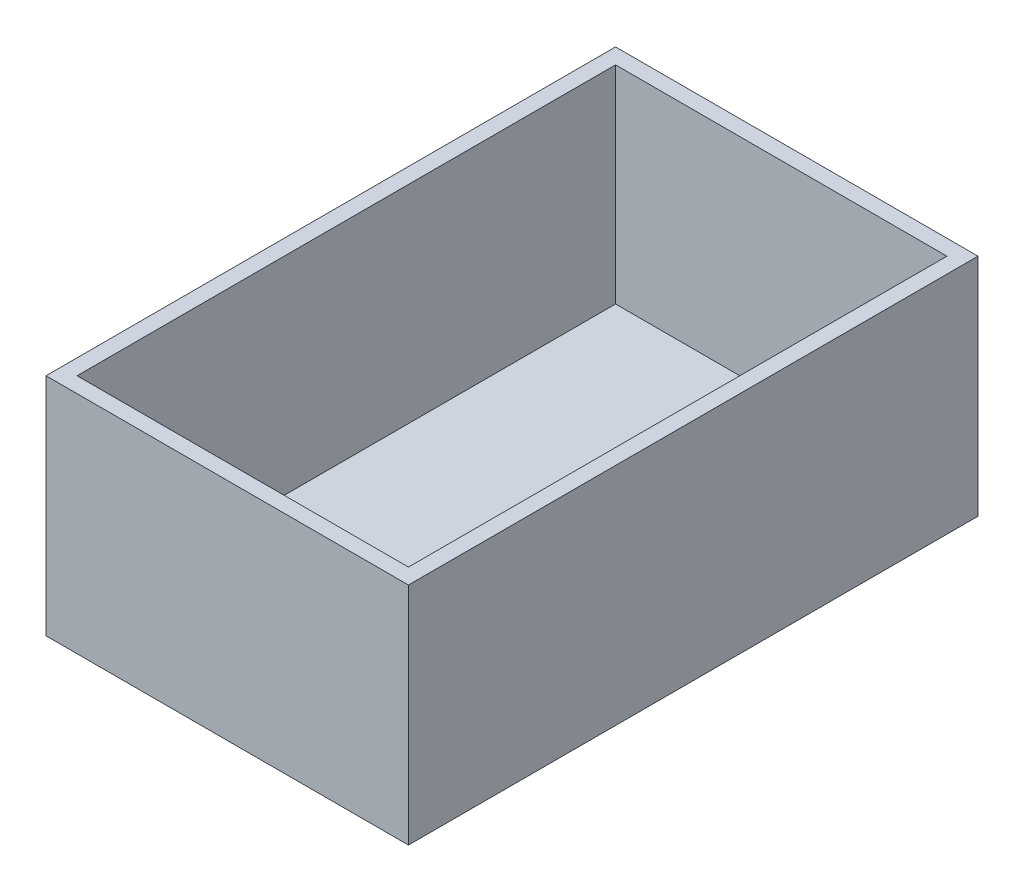
ISO-10303-21;
HEADER;
FILE_DESCRIPTION(('STEP AP214'),'2;1');
FILE_NAME('part.step','',(''),(''),'','','');
FILE_SCHEMA(('AUTOMOTIVE_DESIGN { 1 0 10303 214 1 1 1 1 }'));
ENDSEC;
DATA;
#1=APPLICATION_CONTEXT('core data for automotive mechanical design processes');
#2=APPLICATION_PROTOCOL_DEFINITION('international standard','automotive_design',2000,#1);
#3=PRODUCT_CONTEXT('',#1,'mechanical');
#4=PRODUCT('Part','Part','',(#3));
#5=PRODUCT_RELATED_PRODUCT_CATEGORY('part','',(#4));
#6=PRODUCT_DEFINITION_FORMATION('','',#4);
#7=PRODUCT_DEFINITION_CONTEXT('part definition',#1,'design');
#8=PRODUCT_DEFINITION('design','',#6,#7);
#9=PRODUCT_DEFINITION_SHAPE('','',#8);
#10=(LENGTH_UNIT() NAMED_UNIT(*) SI_UNIT(.MILLI.,.METRE.));
#11=(NAMED_UNIT(*) PLANE_ANGLE_UNIT() SI_UNIT($,.RADIAN.));
#12=(NAMED_UNIT(*) SI_UNIT($,.STERADIAN.) SOLID_ANGLE_UNIT());
#13=UNCERTAINTY_MEASURE_WITH_UNIT(LENGTH_MEASURE(1.E-05),#10,'distance_accuracy_value','');
#14=(GEOMETRIC_REPRESENTATION_CONTEXT(3) GLOBAL_UNCERTAINTY_ASSIGNED_CONTEXT((#13)) GLOBAL_UNIT_ASSIGNED_CONTEXT((#10,
#11,#12)) REPRESENTATION_CONTEXT('',''));
#15=CARTESIAN_POINT('',(0.,0.,0.));
#16=DIRECTION('',(0.,0.,1.));
#17=DIRECTION('',(1.,0.,0.));
#18=AXIS2_PLACEMENT_3D('',#15,#16,#17);
#19=CARTESIAN_POINT('',(-35.,3.5,55.));
#20=DIRECTION('',(1.,0.,0.));
#21=DIRECTION('',(0.,0.,-1.));
#22=AXIS2_PLACEMENT_3D('',#19,#20,#21);
#23=PLANE('',#22);
#24=DIRECTION('',(0.,0.,1.));
#25=VECTOR('',#24,1.);
#26=CARTESIAN_POINT('',(-35.,0.,55.));
#27=LINE('',#26,#25);
#28=CARTESIAN_POINT('',(-35.,0.,-55.));
#29=VERTEX_POINT('',#28);
#30=CARTESIAN_POINT('',(-35.,0.,55.));
#31=VERTEX_POINT('',#30);
#32=EDGE_CURVE('E144',#29,#31,#27,.T.);
#33=ORIENTED_EDGE('',*,*,#32,.T.);
#34=DIRECTION('',(0.,-1.,0.));
#35=VECTOR('',#34,1.);
#36=CARTESIAN_POINT('',(-35.,3.5,55.));
#37=LINE('',#36,#35);
#38=CARTESIAN_POINT('',(-35.,43.5,55.));
#39=VERTEX_POINT('',#38);
#40=EDGE_CURVE('E11',#39,#31,#37,.T.);
#41=ORIENTED_EDGE('',*,*,#40,.F.);
#42=DIRECTION('',(0.,0.,1.));
#43=VECTOR('',#42,1.);
#44=CARTESIAN_POINT('',(-35.,43.5,55.));
#45=LINE('',#44,#43);
#46=CARTESIAN_POINT('',(-35.,43.5,-55.));
#47=VERTEX_POINT('',#46);
#48=EDGE_CURVE('E111',#47,#39,#45,.T.);
#49=ORIENTED_EDGE('',*,*,#48,.F.);
#50=DIRECTION('',(0.,-1.,0.));
#51=VECTOR('',#50,1.);
#52=CARTESIAN_POINT('',(-35.,3.5,-55.));
#53=LINE('',#52,#51);
#54=EDGE_CURVE('E153',#47,#29,#53,.T.);
#55=ORIENTED_EDGE('',*,*,#54,.T.);
#56=EDGE_LOOP('',(#33,#41,#49,#55));
#57=FACE_BOUND('',#56,.T.);
#58=ADVANCED_FACE('F33',(#57),#23,.F.);
#59=CARTESIAN_POINT('',(35.,3.5,55.));
#60=DIRECTION('',(0.,0.,-1.));
#61=DIRECTION('',(-1.,0.,0.));
#62=AXIS2_PLACEMENT_3D('',#59,#60,#61);
#63=PLANE('',#62);
#64=DIRECTION('',(1.,0.,0.));
#65=VECTOR('',#64,1.);
#66=CARTESIAN_POINT('',(35.,0.,55.));
#67=LINE('',#66,#65);
#68=CARTESIAN_POINT('',(35.,0.,55.));
#69=VERTEX_POINT('',#68);
#70=EDGE_CURVE('E147',#31,#69,#67,.T.);
#71=ORIENTED_EDGE('',*,*,#70,.T.);
#72=DIRECTION('',(0.,-1.,0.));
#73=VECTOR('',#72,1.);
#74=CARTESIAN_POINT('',(35.,3.5,55.));
#75=LINE('',#74,#73);
#76=CARTESIAN_POINT('',(35.,43.5,55.));
#77=VERTEX_POINT('',#76);
#78=EDGE_CURVE('E40',#77,#69,#75,.T.);
#79=ORIENTED_EDGE('',*,*,#78,.F.);
#80=DIRECTION('',(1.,0.,0.));
#81=VECTOR('',#80,1.);
#82=CARTESIAN_POINT('',(35.,43.5,55.));
#83=LINE('',#82,#81);
#84=EDGE_CURVE('E135',#39,#77,#83,.T.);
#85=ORIENTED_EDGE('',*,*,#84,.F.);
#86=ORIENTED_EDGE('',*,*,#40,.T.);
#87=EDGE_LOOP('',(#71,#79,#85,#86));
#88=FACE_BOUND('',#87,.T.);
#89=ADVANCED_FACE('F175',(#88),#63,.F.);
#90=CARTESIAN_POINT('',(35.,3.5,55.));
#91=DIRECTION('',(-1.,0.,0.));
#92=DIRECTION('',(0.,0.,1.));
#93=AXIS2_PLACEMENT_3D('',#90,#91,#92);
#94=PLANE('',#93);
#95=DIRECTION('',(0.,0.,-1.));
#96=VECTOR('',#95,1.);
#97=CARTESIAN_POINT('',(35.,0.,55.));
#98=LINE('',#97,#96);
#99=CARTESIAN_POINT('',(35.,0.,-55.));
#100=VERTEX_POINT('',#99);
#101=EDGE_CURVE('E149',#69,#100,#98,.T.);
#102=ORIENTED_EDGE('',*,*,#101,.T.);
#103=DIRECTION('',(0.,-1.,0.));
#104=VECTOR('',#103,1.);
#105=CARTESIAN_POINT('',(35.,3.5,-55.));
#106=LINE('',#105,#104);
#107=CARTESIAN_POINT('',(35.,43.5,-55.));
#108=VERTEX_POINT('',#107);
#109=EDGE_CURVE('E156',#108,#100,#106,.T.);
#110=ORIENTED_EDGE('',*,*,#109,.F.);
#111=DIRECTION('',(0.,0.,-1.));
#112=VECTOR('',#111,1.);
#113=CARTESIAN_POINT('',(35.,43.5,-55.));
#114=LINE('',#113,#112);
#115=EDGE_CURVE('E138',#77,#108,#114,.T.);
#116=ORIENTED_EDGE('',*,*,#115,.F.);
#117=ORIENTED_EDGE('',*,*,#78,.T.);
#118=EDGE_LOOP('',(#102,#110,#116,#117));
#119=FACE_BOUND('',#118,.T.);
#120=ADVANCED_FACE('F162',(#119),#94,.F.);
#121=CARTESIAN_POINT('',(35.,3.5,-55.));
#122=DIRECTION('',(0.,0.,1.));
#123=DIRECTION('',(1.,0.,0.));
#124=AXIS2_PLACEMENT_3D('',#121,#122,#123);
#125=PLANE('',#124);
#126=DIRECTION('',(-1.,0.,0.));
#127=VECTOR('',#126,1.);
#128=CARTESIAN_POINT('',(35.,0.,-55.));
#129=LINE('',#128,#127);
#130=EDGE_CURVE('E151',#100,#29,#129,.T.);
#131=ORIENTED_EDGE('',*,*,#130,.T.);
#132=ORIENTED_EDGE('',*,*,#54,.F.);
#133=DIRECTION('',(-1.,0.,0.));
#134=VECTOR('',#133,1.);
#135=CARTESIAN_POINT('',(-35.,43.5,-55.));
#136=LINE('',#135,#134);
#137=EDGE_CURVE('E141',#108,#47,#136,.T.);
#138=ORIENTED_EDGE('',*,*,#137,.F.);
#139=ORIENTED_EDGE('',*,*,#109,.T.);
#140=EDGE_LOOP('',(#131,#132,#138,#139));
#141=FACE_BOUND('',#140,.T.);
#142=ADVANCED_FACE('F170',(#141),#125,.F.);
#143=CARTESIAN_POINT('',(0.,0.,0.));
#144=DIRECTION('',(0.,1.,0.));
#145=DIRECTION('',(0.,0.,1.));
#146=AXIS2_PLACEMENT_3D('',#143,#144,#145);
#147=PLANE('',#146);
#148=ORIENTED_EDGE('',*,*,#32,.F.);
#149=ORIENTED_EDGE('',*,*,#130,.F.);
#150=ORIENTED_EDGE('',*,*,#101,.F.);
#151=ORIENTED_EDGE('',*,*,#70,.F.);
#152=EDGE_LOOP('',(#148,#149,#150,#151));
#153=FACE_BOUND('',#152,.T.);
#154=ADVANCED_FACE('F168',(#153),#147,.F.);
#155=CARTESIAN_POINT('',(0.,43.5,0.));
#156=DIRECTION('',(0.,-1.,0.));
#157=DIRECTION('',(0.,0.,-1.));
#158=AXIS2_PLACEMENT_3D('',#155,#156,#157);
#159=PLANE('',#158);
#160=ORIENTED_EDGE('',*,*,#48,.T.);
#161=ORIENTED_EDGE('',*,*,#84,.T.);
#162=ORIENTED_EDGE('',*,*,#115,.T.);
#163=ORIENTED_EDGE('',*,*,#137,.T.);
#164=EDGE_LOOP('',(#160,#161,#162,#163));
#165=FACE_BOUND('',#164,.T.);
#166=DIRECTION('',(0.,0.,1.));
#167=VECTOR('',#166,1.);
#168=CARTESIAN_POINT('',(-32.,43.5,52.));
#169=LINE('',#168,#167);
#170=CARTESIAN_POINT('',(-32.,43.5,-52.));
#171=VERTEX_POINT('',#170);
#172=CARTESIAN_POINT('',(-32.,43.5,52.));
#173=VERTEX_POINT('',#172);
#174=EDGE_CURVE('E96',#171,#173,#169,.T.);
#175=ORIENTED_EDGE('',*,*,#174,.F.);
#176=DIRECTION('',(-1.,0.,0.));
#177=VECTOR('',#176,1.);
#178=CARTESIAN_POINT('',(-32.,43.5,-52.));
#179=LINE('',#178,#177);
#180=CARTESIAN_POINT('',(32.,43.5,-52.));
#181=VERTEX_POINT('',#180);
#182=EDGE_CURVE('E119',#181,#171,#179,.T.);
#183=ORIENTED_EDGE('',*,*,#182,.F.);
#184=DIRECTION('',(0.,0.,-1.));
#185=VECTOR('',#184,1.);
#186=CARTESIAN_POINT('',(32.,43.5,-52.));
#187=LINE('',#186,#185);
#188=CARTESIAN_POINT('',(32.,43.5,52.));
#189=VERTEX_POINT('',#188);
#190=EDGE_CURVE('E117',#189,#181,#187,.T.);
#191=ORIENTED_EDGE('',*,*,#190,.F.);
#192=DIRECTION('',(1.,0.,0.));
#193=VECTOR('',#192,1.);
#194=CARTESIAN_POINT('',(32.,43.5,52.));
#195=LINE('',#194,#193);
#196=EDGE_CURVE('E105',#173,#189,#195,.T.);
#197=ORIENTED_EDGE('',*,*,#196,.F.);
#198=EDGE_LOOP('',(#175,#183,#191,#197));
#199=FACE_BOUND('',#198,.T.);
#200=ADVANCED_FACE('F115',(#165,#199),#159,.F.);
#201=CARTESIAN_POINT('',(-32.,43.5,52.));
#202=DIRECTION('',(1.,0.,0.));
#203=DIRECTION('',(0.,0.,-1.));
#204=AXIS2_PLACEMENT_3D('',#201,#202,#203);
#205=PLANE('',#204);
#206=DIRECTION('',(0.,0.,1.));
#207=VECTOR('',#206,1.);
#208=CARTESIAN_POINT('',(-32.,3.5,52.));
#209=LINE('',#208,#207);
#210=CARTESIAN_POINT('',(-32.,3.5,-52.));
#211=VERTEX_POINT('',#210);
#212=CARTESIAN_POINT('',(-32.,3.5,52.));
#213=VERTEX_POINT('',#212);
#214=EDGE_CURVE('E47',#211,#213,#209,.T.);
#215=ORIENTED_EDGE('',*,*,#214,.F.);
#216=DIRECTION('',(0.,-1.,0.));
#217=VECTOR('',#216,1.);
#218=CARTESIAN_POINT('',(-32.,43.5,-52.));
#219=LINE('',#218,#217);
#220=EDGE_CURVE('E101',#171,#211,#219,.T.);
#221=ORIENTED_EDGE('',*,*,#220,.F.);
#222=ORIENTED_EDGE('',*,*,#174,.T.);
#223=DIRECTION('',(0.,-1.,0.));
#224=VECTOR('',#223,1.);
#225=CARTESIAN_POINT('',(-32.,43.5,52.));
#226=LINE('',#225,#224);
#227=EDGE_CURVE('E99',#173,#213,#226,.T.);
#228=ORIENTED_EDGE('',*,*,#227,.T.);
#229=EDGE_LOOP('',(#215,#221,#222,#228));
#230=FACE_BOUND('',#229,.T.);
#231=ADVANCED_FACE('F98',(#230),#205,.T.);
#232=CARTESIAN_POINT('',(32.,43.5,52.));
#233=DIRECTION('',(0.,0.,-1.));
#234=DIRECTION('',(-1.,0.,0.));
#235=AXIS2_PLACEMENT_3D('',#232,#233,#234);
#236=PLANE('',#235);
#237=DIRECTION('',(1.,0.,0.));
#238=VECTOR('',#237,1.);
#239=CARTESIAN_POINT('',(32.,3.5,52.));
#240=LINE('',#239,#238);
#241=CARTESIAN_POINT('',(32.,3.5,52.));
#242=VERTEX_POINT('',#241);
#243=EDGE_CURVE('E51',#213,#242,#240,.T.);
#244=ORIENTED_EDGE('',*,*,#243,.F.);
#245=ORIENTED_EDGE('',*,*,#227,.F.);
#246=ORIENTED_EDGE('',*,*,#196,.T.);
#247=DIRECTION('',(0.,-1.,0.));
#248=VECTOR('',#247,1.);
#249=CARTESIAN_POINT('',(32.,43.5,52.));
#250=LINE('',#249,#248);
#251=EDGE_CURVE('E112',#189,#242,#250,.T.);
#252=ORIENTED_EDGE('',*,*,#251,.T.);
#253=EDGE_LOOP('',(#244,#245,#246,#252));
#254=FACE_BOUND('',#253,.T.);
#255=ADVANCED_FACE('F109',(#254),#236,.T.);
#256=CARTESIAN_POINT('',(32.,43.5,-52.));
#257=DIRECTION('',(-1.,0.,0.));
#258=DIRECTION('',(0.,0.,1.));
#259=AXIS2_PLACEMENT_3D('',#256,#257,#258);
#260=PLANE('',#259);
#261=DIRECTION('',(0.,0.,-1.));
#262=VECTOR('',#261,1.);
#263=CARTESIAN_POINT('',(32.,3.5,-52.));
#264=LINE('',#263,#262);
#265=CARTESIAN_POINT('',(32.,3.5,-52.));
#266=VERTEX_POINT('',#265);
#267=EDGE_CURVE('E125',#242,#266,#264,.T.);
#268=ORIENTED_EDGE('',*,*,#267,.F.);
#269=ORIENTED_EDGE('',*,*,#251,.F.);
#270=ORIENTED_EDGE('',*,*,#190,.T.);
#271=DIRECTION('',(0.,-1.,0.));
#272=VECTOR('',#271,1.);
#273=CARTESIAN_POINT('',(32.,43.5,-52.));
#274=LINE('',#273,#272);
#275=EDGE_CURVE('E129',#181,#266,#274,.T.);
#276=ORIENTED_EDGE('',*,*,#275,.T.);
#277=EDGE_LOOP('',(#268,#269,#270,#276));
#278=FACE_BOUND('',#277,.T.);
#279=ADVANCED_FACE('F197',(#278),#260,.T.);
#280=CARTESIAN_POINT('',(-32.,43.5,-52.));
#281=DIRECTION('',(0.,0.,1.));
#282=DIRECTION('',(1.,0.,0.));
#283=AXIS2_PLACEMENT_3D('',#280,#281,#282);
#284=PLANE('',#283);
#285=DIRECTION('',(-1.,0.,0.));
#286=VECTOR('',#285,1.);
#287=CARTESIAN_POINT('',(-32.,3.5,-52.));
#288=LINE('',#287,#286);
#289=EDGE_CURVE('E106',#266,#211,#288,.T.);
#290=ORIENTED_EDGE('',*,*,#289,.F.);
#291=ORIENTED_EDGE('',*,*,#275,.F.);
#292=ORIENTED_EDGE('',*,*,#182,.T.);
#293=ORIENTED_EDGE('',*,*,#220,.T.);
#294=EDGE_LOOP('',(#290,#291,#292,#293));
#295=FACE_BOUND('',#294,.T.);
#296=ADVANCED_FACE('F190',(#295),#284,.T.);
#297=CARTESIAN_POINT('',(0.,3.5,0.));
#298=DIRECTION('',(0.,1.,0.));
#299=DIRECTION('',(0.,0.,1.));
#300=AXIS2_PLACEMENT_3D('',#297,#298,#299);
#301=PLANE('',#300);
#302=ORIENTED_EDGE('',*,*,#214,.T.);
#303=ORIENTED_EDGE('',*,*,#243,.T.);
#304=ORIENTED_EDGE('',*,*,#267,.T.);
#305=ORIENTED_EDGE('',*,*,#289,.T.);
#306=EDGE_LOOP('',(#302,#303,#304,#305));
#307=FACE_BOUND('',#306,.T.);
#308=ADVANCED_FACE('F187',(#307),#301,.T.);
#309=CLOSED_SHELL('',(#58,#89,#120,#142,#154,#200,#231,#255,#279,#296,#308));
#310=MANIFOLD_SOLID_BREP('B2',#309);
#311=ADVANCED_BREP_SHAPE_REPRESENTATION('',(#18,#310),#14);
#312=SHAPE_DEFINITION_REPRESENTATION(#9,#311);
ENDSEC;
END-ISO-10303-21;
